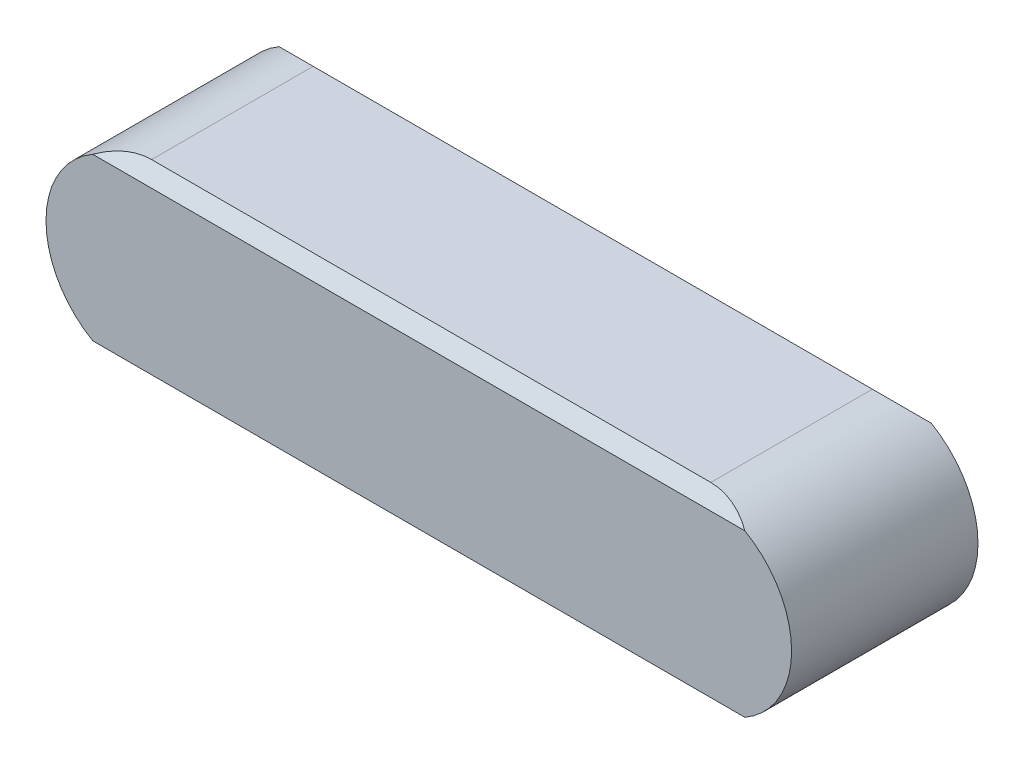
ISO-10303-21;
HEADER;
FILE_DESCRIPTION(('STEP AP214'),'2;1');
FILE_NAME('part.step','',(''),(''),'','','');
FILE_SCHEMA(('AUTOMOTIVE_DESIGN { 1 0 10303 214 1 1 1 1 }'));
ENDSEC;
DATA;
#1=APPLICATION_CONTEXT('core data for automotive mechanical design processes');
#2=APPLICATION_PROTOCOL_DEFINITION('international standard','automotive_design',2000,#1);
#3=PRODUCT_CONTEXT('',#1,'mechanical');
#4=PRODUCT('Part','Part','',(#3));
#5=PRODUCT_RELATED_PRODUCT_CATEGORY('part','',(#4));
#6=PRODUCT_DEFINITION_FORMATION('','',#4);
#7=PRODUCT_DEFINITION_CONTEXT('part definition',#1,'design');
#8=PRODUCT_DEFINITION('design','',#6,#7);
#9=PRODUCT_DEFINITION_SHAPE('','',#8);
#10=(LENGTH_UNIT() NAMED_UNIT(*) SI_UNIT(.MILLI.,.METRE.));
#11=(NAMED_UNIT(*) PLANE_ANGLE_UNIT() SI_UNIT($,.RADIAN.));
#12=(NAMED_UNIT(*) SI_UNIT($,.STERADIAN.) SOLID_ANGLE_UNIT());
#13=UNCERTAINTY_MEASURE_WITH_UNIT(LENGTH_MEASURE(1.E-05),#10,'distance_accuracy_value','');
#14=(GEOMETRIC_REPRESENTATION_CONTEXT(3) GLOBAL_UNCERTAINTY_ASSIGNED_CONTEXT((#13)) GLOBAL_UNIT_ASSIGNED_CONTEXT((#10,
#11,#12)) REPRESENTATION_CONTEXT('',''));
#15=CARTESIAN_POINT('',(0.,0.,0.));
#16=DIRECTION('',(0.,0.,1.));
#17=DIRECTION('',(1.,0.,0.));
#18=AXIS2_PLACEMENT_3D('',#15,#16,#17);
#19=CARTESIAN_POINT('',(12.,3.,2.8));
#20=DIRECTION('',(0.,-0.707106781186548,-0.707106781186548));
#21=DIRECTION('',(0.,0.707106781186548,-0.707106781186548));
#22=AXIS2_PLACEMENT_3D('',#19,#20,#21);
#23=PLANE('',#22);
#24=DIRECTION('',(1.,0.,0.));
#25=VECTOR('',#24,1.);
#26=CARTESIAN_POINT('',(1.50000000000004,2.8,3.));
#27=LINE('',#26,#25);
#28=CARTESIAN_POINT('',(0.751668522645239,2.8,3.));
#29=VERTEX_POINT('',#28);
#30=CARTESIAN_POINT('',(11.248331477355,2.8,3.));
#31=VERTEX_POINT('',#30);
#32=EDGE_CURVE('E10',#29,#31,#27,.T.);
#33=ORIENTED_EDGE('',*,*,#32,.T.);
#34=CARTESIAN_POINT('',(10.5000000000003,1.50000000000027,4.29999999999973));
#35=DIRECTION('',(0.,-0.707106781186548,-0.707106781186548));
#36=DIRECTION('',(0.,0.707106781186548,-0.707106781186548));
#37=AXIS2_PLACEMENT_3D('',#34,#35,#36);
#38=ELLIPSE('',#37,2.1213203436,1.5);
#39=CARTESIAN_POINT('',(10.5,3.,2.8));
#40=VERTEX_POINT('',#39);
#41=EDGE_CURVE('E24',#40,#31,#38,.T.);
#42=ORIENTED_EDGE('',*,*,#41,.F.);
#43=DIRECTION('',(-1.,0.,0.));
#44=VECTOR('',#43,1.);
#45=CARTESIAN_POINT('',(12.,3.,2.8));
#46=LINE('',#45,#44);
#47=CARTESIAN_POINT('',(1.5,3.,2.8));
#48=VERTEX_POINT('',#47);
#49=EDGE_CURVE('E183',#40,#48,#46,.T.);
#50=ORIENTED_EDGE('',*,*,#49,.T.);
#51=CARTESIAN_POINT('',(1.50000000000004,1.49999999999996,4.30000000000004));
#52=DIRECTION('',(0.,-0.707106781186548,-0.707106781186548));
#53=DIRECTION('',(0.,0.707106781186548,-0.707106781186548));
#54=AXIS2_PLACEMENT_3D('',#51,#52,#53);
#55=ELLIPSE('',#54,2.1213203436,1.5);
#56=EDGE_CURVE('E178',#29,#48,#55,.T.);
#57=ORIENTED_EDGE('',*,*,#56,.F.);
#58=EDGE_LOOP('',(#33,#42,#50,#57));
#59=FACE_BOUND('',#58,.T.);
#60=ADVANCED_FACE('F16',(#59),#23,.F.);
#61=CARTESIAN_POINT('',(1.5,1.5,3.));
#62=DIRECTION('',(0.,0.,1.));
#63=DIRECTION('',(1.,0.,0.));
#64=AXIS2_PLACEMENT_3D('',#61,#62,#63);
#65=CYLINDRICAL_SURFACE('',#64,1.5);
#66=CARTESIAN_POINT('',(1.5,1.5,0.));
#67=DIRECTION('',(0.,0.,1.));
#68=DIRECTION('',(1.,0.,0.));
#69=AXIS2_PLACEMENT_3D('',#66,#67,#68);
#70=CIRCLE('',#69,1.5);
#71=CARTESIAN_POINT('',(0.75166852264524,2.8,0.));
#72=VERTEX_POINT('',#71);
#73=CARTESIAN_POINT('',(0.751668522645215,0.2,0.));
#74=VERTEX_POINT('',#73);
#75=EDGE_CURVE('E174',#72,#74,#70,.T.);
#76=ORIENTED_EDGE('',*,*,#75,.T.);
#77=CARTESIAN_POINT('',(1.5,1.5,-1.3));
#78=DIRECTION('',(0.,0.707106781186548,0.707106781186548));
#79=DIRECTION('',(0.,0.707106781186548,-0.707106781186548));
#80=AXIS2_PLACEMENT_3D('',#77,#78,#79);
#81=ELLIPSE('',#80,2.1213203436,1.5);
#82=CARTESIAN_POINT('',(1.5,0.,0.2));
#83=VERTEX_POINT('',#82);
#84=EDGE_CURVE('E170',#74,#83,#81,.T.);
#85=ORIENTED_EDGE('',*,*,#84,.T.);
#86=DIRECTION('',(0.,0.,-1.));
#87=VECTOR('',#86,1.);
#88=CARTESIAN_POINT('',(1.5,0.,3.));
#89=LINE('',#88,#87);
#90=CARTESIAN_POINT('',(1.5,0.,2.8));
#91=VERTEX_POINT('',#90);
#92=EDGE_CURVE('E165',#91,#83,#89,.T.);
#93=ORIENTED_EDGE('',*,*,#92,.F.);
#94=CARTESIAN_POINT('',(1.5,1.5,4.3));
#95=DIRECTION('',(0.,0.707106781186548,-0.707106781186547));
#96=DIRECTION('',(0.,-0.707106781186547,-0.707106781186548));
#97=AXIS2_PLACEMENT_3D('',#94,#95,#96);
#98=ELLIPSE('',#97,2.1213203436,1.5);
#99=CARTESIAN_POINT('',(0.751668522645214,0.2,3.));
#100=VERTEX_POINT('',#99);
#101=EDGE_CURVE('E161',#91,#100,#98,.T.);
#102=ORIENTED_EDGE('',*,*,#101,.T.);
#103=CARTESIAN_POINT('',(1.5,1.5,3.));
#104=DIRECTION('',(0.,0.,1.));
#105=DIRECTION('',(1.,0.,0.));
#106=AXIS2_PLACEMENT_3D('',#103,#104,#105);
#107=CIRCLE('',#106,1.5);
#108=EDGE_CURVE('E94',#29,#100,#107,.T.);
#109=ORIENTED_EDGE('',*,*,#108,.F.);
#110=ORIENTED_EDGE('',*,*,#56,.T.);
#111=DIRECTION('',(0.,0.,-1.));
#112=VECTOR('',#111,1.);
#113=CARTESIAN_POINT('',(1.5,3.,3.));
#114=LINE('',#113,#112);
#115=CARTESIAN_POINT('',(1.5,3.,0.2));
#116=VERTEX_POINT('',#115);
#117=EDGE_CURVE('E154',#48,#116,#114,.T.);
#118=ORIENTED_EDGE('',*,*,#117,.T.);
#119=CARTESIAN_POINT('',(1.50000000000004,1.49999999999996,-1.30000000000004));
#120=DIRECTION('',(0.,-0.707106781186547,0.707106781186548));
#121=DIRECTION('',(0.,-0.707106781186548,-0.707106781186547));
#122=AXIS2_PLACEMENT_3D('',#119,#120,#121);
#123=ELLIPSE('',#122,2.1213203436,1.5);
#124=EDGE_CURVE('E150',#116,#72,#123,.T.);
#125=ORIENTED_EDGE('',*,*,#124,.T.);
#126=EDGE_LOOP('',(#76,#85,#93,#102,#109,#110,#118,#125));
#127=FACE_BOUND('',#126,.T.);
#128=ADVANCED_FACE('F195',(#127),#65,.T.);
#129=CARTESIAN_POINT('',(12.,2.8,0.));
#130=DIRECTION('',(0.,-0.707106781186547,0.707106781186548));
#131=DIRECTION('',(0.,-0.707106781186548,-0.707106781186547));
#132=AXIS2_PLACEMENT_3D('',#129,#130,#131);
#133=PLANE('',#132);
#134=DIRECTION('',(-1.,0.,0.));
#135=VECTOR('',#134,1.);
#136=CARTESIAN_POINT('',(12.,3.,0.2));
#137=LINE('',#136,#135);
#138=CARTESIAN_POINT('',(10.5,3.,0.2));
#139=VERTEX_POINT('',#138);
#140=EDGE_CURVE('E145',#139,#116,#137,.T.);
#141=ORIENTED_EDGE('',*,*,#140,.F.);
#142=CARTESIAN_POINT('',(10.5000000000003,1.50000000000027,-1.29999999999973));
#143=DIRECTION('',(0.,-0.707106781186547,0.707106781186548));
#144=DIRECTION('',(0.,-0.707106781186548,-0.707106781186547));
#145=AXIS2_PLACEMENT_3D('',#142,#143,#144);
#146=ELLIPSE('',#145,2.1213203436,1.5);
#147=CARTESIAN_POINT('',(11.248331477355,2.8,0.));
#148=VERTEX_POINT('',#147);
#149=EDGE_CURVE('E140',#148,#139,#146,.T.);
#150=ORIENTED_EDGE('',*,*,#149,.F.);
#151=DIRECTION('',(1.,0.,0.));
#152=VECTOR('',#151,1.);
#153=CARTESIAN_POINT('',(1.50000000000004,2.8,0.));
#154=LINE('',#153,#152);
#155=EDGE_CURVE('E135',#72,#148,#154,.T.);
#156=ORIENTED_EDGE('',*,*,#155,.F.);
#157=ORIENTED_EDGE('',*,*,#124,.F.);
#158=EDGE_LOOP('',(#141,#150,#156,#157));
#159=FACE_BOUND('',#158,.T.);
#160=ADVANCED_FACE('F199',(#159),#133,.F.);
#161=CARTESIAN_POINT('',(1.50000000000004,1.49999999999996,0.));
#162=DIRECTION('',(0.,0.,1.));
#163=DIRECTION('',(1.,0.,0.));
#164=AXIS2_PLACEMENT_3D('',#161,#162,#163);
#165=PLANE('',#164);
#166=ORIENTED_EDGE('',*,*,#75,.F.);
#167=ORIENTED_EDGE('',*,*,#155,.T.);
#168=CARTESIAN_POINT('',(10.5000000000003,1.50000000000027,0.));
#169=DIRECTION('',(0.,0.,1.));
#170=DIRECTION('',(1.,0.,0.));
#171=AXIS2_PLACEMENT_3D('',#168,#169,#170);
#172=CIRCLE('',#171,1.5);
#173=CARTESIAN_POINT('',(11.248331477355,0.2,0.));
#174=VERTEX_POINT('',#173);
#175=EDGE_CURVE('E130',#174,#148,#172,.T.);
#176=ORIENTED_EDGE('',*,*,#175,.F.);
#177=DIRECTION('',(-1.,0.,0.));
#178=VECTOR('',#177,1.);
#179=CARTESIAN_POINT('',(1.50000000000004,0.2,0.));
#180=LINE('',#179,#178);
#181=EDGE_CURVE('E125',#174,#74,#180,.T.);
#182=ORIENTED_EDGE('',*,*,#181,.T.);
#183=EDGE_LOOP('',(#166,#167,#176,#182));
#184=FACE_BOUND('',#183,.T.);
#185=ADVANCED_FACE('F204',(#184),#165,.F.);
#186=CARTESIAN_POINT('',(12.,0.,0.2));
#187=DIRECTION('',(0.,0.707106781186548,0.707106781186548));
#188=DIRECTION('',(0.,-0.707106781186548,0.707106781186548));
#189=AXIS2_PLACEMENT_3D('',#186,#187,#188);
#190=PLANE('',#189);
#191=ORIENTED_EDGE('',*,*,#181,.F.);
#192=CARTESIAN_POINT('',(10.5000000000003,1.4999999999997,-1.2999999999997));
#193=DIRECTION('',(0.,0.707106781186548,0.707106781186548));
#194=DIRECTION('',(0.,0.707106781186548,-0.707106781186548));
#195=AXIS2_PLACEMENT_3D('',#192,#193,#194);
#196=ELLIPSE('',#195,2.1213203436,1.5);
#197=CARTESIAN_POINT('',(10.5000000000003,0.,0.2));
#198=VERTEX_POINT('',#197);
#199=EDGE_CURVE('E120',#198,#174,#196,.T.);
#200=ORIENTED_EDGE('',*,*,#199,.F.);
#201=DIRECTION('',(-1.,0.,0.));
#202=VECTOR('',#201,1.);
#203=CARTESIAN_POINT('',(12.,0.,0.2));
#204=LINE('',#203,#202);
#205=EDGE_CURVE('E115',#198,#83,#204,.T.);
#206=ORIENTED_EDGE('',*,*,#205,.T.);
#207=ORIENTED_EDGE('',*,*,#84,.F.);
#208=EDGE_LOOP('',(#191,#200,#206,#207));
#209=FACE_BOUND('',#208,.T.);
#210=ADVANCED_FACE('F207',(#209),#190,.F.);
#211=CARTESIAN_POINT('',(1.5,0.,3.));
#212=DIRECTION('',(0.,1.,0.));
#213=DIRECTION('',(0.,0.,1.));
#214=AXIS2_PLACEMENT_3D('',#211,#212,#213);
#215=PLANE('',#214);
#216=ORIENTED_EDGE('',*,*,#92,.T.);
#217=ORIENTED_EDGE('',*,*,#205,.F.);
#218=DIRECTION('',(0.,0.,-1.));
#219=VECTOR('',#218,1.);
#220=CARTESIAN_POINT('',(10.5,0.,3.));
#221=LINE('',#220,#219);
#222=CARTESIAN_POINT('',(10.5000000000003,0.,2.8));
#223=VERTEX_POINT('',#222);
#224=EDGE_CURVE('E111',#223,#198,#221,.T.);
#225=ORIENTED_EDGE('',*,*,#224,.F.);
#226=DIRECTION('',(-1.,0.,0.));
#227=VECTOR('',#226,1.);
#228=CARTESIAN_POINT('',(12.,0.,2.8));
#229=LINE('',#228,#227);
#230=EDGE_CURVE('E85',#223,#91,#229,.T.);
#231=ORIENTED_EDGE('',*,*,#230,.T.);
#232=EDGE_LOOP('',(#216,#217,#225,#231));
#233=FACE_BOUND('',#232,.T.);
#234=ADVANCED_FACE('F210',(#233),#215,.F.);
#235=CARTESIAN_POINT('',(12.,0.2,3.));
#236=DIRECTION('',(0.,0.707106781186548,-0.707106781186547));
#237=DIRECTION('',(0.,0.707106781186547,0.707106781186548));
#238=AXIS2_PLACEMENT_3D('',#235,#236,#237);
#239=PLANE('',#238);
#240=ORIENTED_EDGE('',*,*,#230,.F.);
#241=CARTESIAN_POINT('',(10.5000000000003,1.4999999999997,4.2999999999997));
#242=DIRECTION('',(0.,0.707106781186548,-0.707106781186547));
#243=DIRECTION('',(0.,-0.707106781186547,-0.707106781186548));
#244=AXIS2_PLACEMENT_3D('',#241,#242,#243);
#245=ELLIPSE('',#244,2.1213203436,1.5);
#246=CARTESIAN_POINT('',(11.248331477355,0.2,3.));
#247=VERTEX_POINT('',#246);
#248=EDGE_CURVE('E78',#247,#223,#245,.T.);
#249=ORIENTED_EDGE('',*,*,#248,.F.);
#250=DIRECTION('',(-1.,0.,0.));
#251=VECTOR('',#250,1.);
#252=CARTESIAN_POINT('',(1.50000000000004,0.2,3.));
#253=LINE('',#252,#251);
#254=EDGE_CURVE('E82',#247,#100,#253,.T.);
#255=ORIENTED_EDGE('',*,*,#254,.T.);
#256=ORIENTED_EDGE('',*,*,#101,.F.);
#257=EDGE_LOOP('',(#240,#249,#255,#256));
#258=FACE_BOUND('',#257,.T.);
#259=ADVANCED_FACE('F80',(#258),#239,.F.);
#260=CARTESIAN_POINT('',(1.50000000000004,1.49999999999996,3.));
#261=DIRECTION('',(0.,0.,1.));
#262=DIRECTION('',(1.,0.,0.));
#263=AXIS2_PLACEMENT_3D('',#260,#261,#262);
#264=PLANE('',#263);
#265=ORIENTED_EDGE('',*,*,#32,.F.);
#266=ORIENTED_EDGE('',*,*,#108,.T.);
#267=ORIENTED_EDGE('',*,*,#254,.F.);
#268=CARTESIAN_POINT('',(10.5000000000003,1.50000000000027,3.));
#269=DIRECTION('',(0.,0.,1.));
#270=DIRECTION('',(1.,0.,0.));
#271=AXIS2_PLACEMENT_3D('',#268,#269,#270);
#272=CIRCLE('',#271,1.5);
#273=EDGE_CURVE('E92',#247,#31,#272,.T.);
#274=ORIENTED_EDGE('',*,*,#273,.T.);
#275=EDGE_LOOP('',(#265,#266,#267,#274));
#276=FACE_BOUND('',#275,.T.);
#277=ADVANCED_FACE('F91',(#276),#264,.T.);
#278=CARTESIAN_POINT('',(10.5000000000003,1.50000000000027,3.));
#279=DIRECTION('',(0.,0.,1.));
#280=DIRECTION('',(-1.,0.,0.));
#281=AXIS2_PLACEMENT_3D('',#278,#279,#280);
#282=CYLINDRICAL_SURFACE('',#281,1.5);
#283=DIRECTION('',(0.,0.,-1.));
#284=VECTOR('',#283,1.);
#285=CARTESIAN_POINT('',(10.5,3.,3.));
#286=LINE('',#285,#284);
#287=EDGE_CURVE('E97',#40,#139,#286,.T.);
#288=ORIENTED_EDGE('',*,*,#287,.F.);
#289=ORIENTED_EDGE('',*,*,#41,.T.);
#290=ORIENTED_EDGE('',*,*,#273,.F.);
#291=ORIENTED_EDGE('',*,*,#248,.T.);
#292=ORIENTED_EDGE('',*,*,#224,.T.);
#293=ORIENTED_EDGE('',*,*,#199,.T.);
#294=ORIENTED_EDGE('',*,*,#175,.T.);
#295=ORIENTED_EDGE('',*,*,#149,.T.);
#296=EDGE_LOOP('',(#288,#289,#290,#291,#292,#293,#294,#295));
#297=FACE_BOUND('',#296,.T.);
#298=ADVANCED_FACE('F96',(#297),#282,.T.);
#299=CARTESIAN_POINT('',(10.5,3.,3.));
#300=DIRECTION('',(0.,-1.,0.));
#301=DIRECTION('',(0.,0.,-1.));
#302=AXIS2_PLACEMENT_3D('',#299,#300,#301);
#303=PLANE('',#302);
#304=ORIENTED_EDGE('',*,*,#117,.F.);
#305=ORIENTED_EDGE('',*,*,#49,.F.);
#306=ORIENTED_EDGE('',*,*,#287,.T.);
#307=ORIENTED_EDGE('',*,*,#140,.T.);
#308=EDGE_LOOP('',(#304,#305,#306,#307));
#309=FACE_BOUND('',#308,.T.);
#310=ADVANCED_FACE('F197',(#309),#303,.F.);
#311=CLOSED_SHELL('',(#60,#128,#160,#185,#210,#234,#259,#277,#298,#310));
#312=MANIFOLD_SOLID_BREP('B1',#311);
#313=ADVANCED_BREP_SHAPE_REPRESENTATION('',(#18,#312),#14);
#314=SHAPE_DEFINITION_REPRESENTATION(#9,#313);
ENDSEC;
END-ISO-10303-21;
